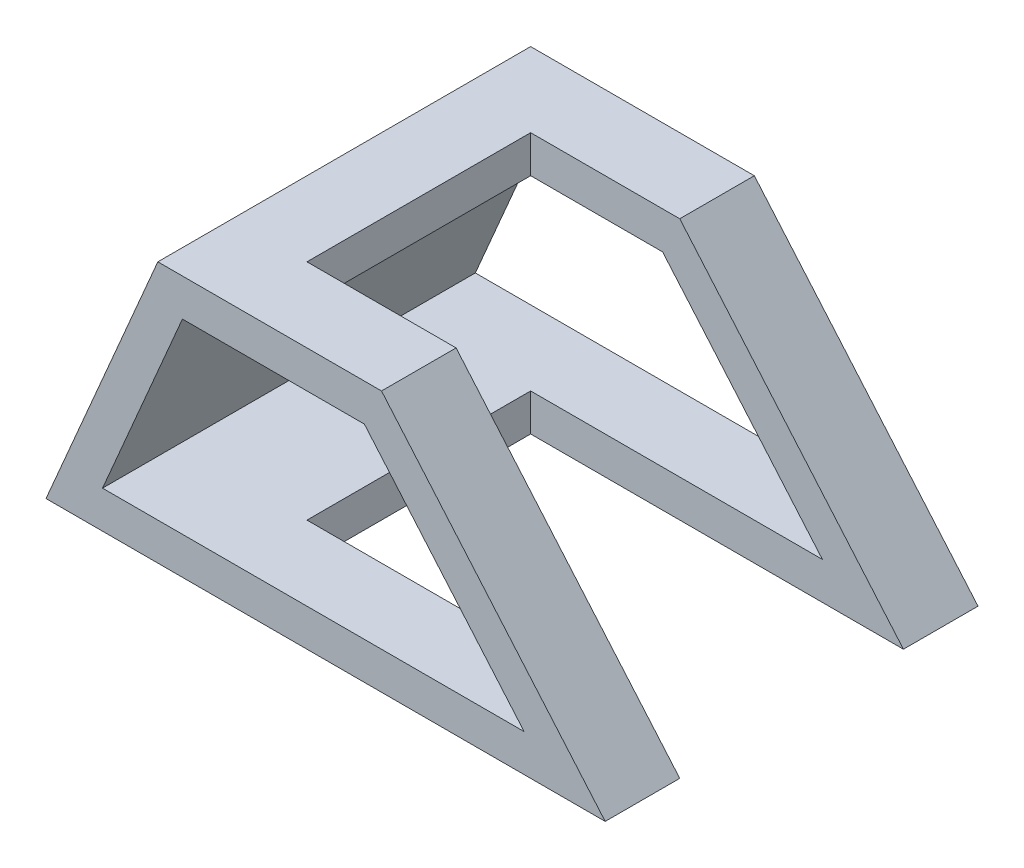
ISO-10303-21;
HEADER;
FILE_DESCRIPTION(('STEP AP214'),'2;1');
FILE_NAME('part.step','',(''),(''),'','','');
FILE_SCHEMA(('AUTOMOTIVE_DESIGN { 1 0 10303 214 1 1 1 1 }'));
ENDSEC;
DATA;
#1=APPLICATION_CONTEXT('core data for automotive mechanical design processes');
#2=APPLICATION_PROTOCOL_DEFINITION('international standard','automotive_design',2000,#1);
#3=PRODUCT_CONTEXT('',#1,'mechanical');
#4=PRODUCT('Part','Part','',(#3));
#5=PRODUCT_RELATED_PRODUCT_CATEGORY('part','',(#4));
#6=PRODUCT_DEFINITION_FORMATION('','',#4);
#7=PRODUCT_DEFINITION_CONTEXT('part definition',#1,'design');
#8=PRODUCT_DEFINITION('design','',#6,#7);
#9=PRODUCT_DEFINITION_SHAPE('','',#8);
#10=(LENGTH_UNIT() NAMED_UNIT(*) SI_UNIT(.MILLI.,.METRE.));
#11=(NAMED_UNIT(*) PLANE_ANGLE_UNIT() SI_UNIT($,.RADIAN.));
#12=(NAMED_UNIT(*) SI_UNIT($,.STERADIAN.) SOLID_ANGLE_UNIT());
#13=UNCERTAINTY_MEASURE_WITH_UNIT(LENGTH_MEASURE(1.E-05),#10,'distance_accuracy_value','');
#14=(GEOMETRIC_REPRESENTATION_CONTEXT(3) GLOBAL_UNCERTAINTY_ASSIGNED_CONTEXT((#13)) GLOBAL_UNIT_ASSIGNED_CONTEXT((#10,
#11,#12)) REPRESENTATION_CONTEXT('',''));
#15=CARTESIAN_POINT('',(0.,0.,0.));
#16=DIRECTION('',(0.,0.,1.));
#17=DIRECTION('',(1.,0.,0.));
#18=AXIS2_PLACEMENT_3D('',#15,#16,#17);
#19=CARTESIAN_POINT('',(150.,0.,100.));
#20=DIRECTION('',(-0.759256602365297,-0.650791373455968,0.));
#21=DIRECTION('',(0.650791373455968,-0.759256602365297,0.));
#22=AXIS2_PLACEMENT_3D('',#19,#20,#21);
#23=PLANE('',#22);
#24=DIRECTION('',(0.,0.,-1.));
#25=VECTOR('',#24,1.);
#26=CARTESIAN_POINT('',(150.,0.,100.));
#27=LINE('',#26,#25);
#28=CARTESIAN_POINT('',(150.,0.,100.));
#29=VERTEX_POINT('',#28);
#30=CARTESIAN_POINT('',(150.,0.,80.));
#31=VERTEX_POINT('',#30);
#32=EDGE_CURVE('E174',#29,#31,#27,.T.);
#33=ORIENTED_EDGE('',*,*,#32,.T.);
#34=DIRECTION('',(-0.650791373455968,0.759256602365297,0.));
#35=VECTOR('',#34,1.);
#36=CARTESIAN_POINT('',(150.,0.,80.));
#37=LINE('',#36,#35);
#38=CARTESIAN_POINT('',(90.,70.,80.));
#39=VERTEX_POINT('',#38);
#40=EDGE_CURVE('E204',#31,#39,#37,.T.);
#41=ORIENTED_EDGE('',*,*,#40,.T.);
#42=DIRECTION('',(0.,0.,-1.));
#43=VECTOR('',#42,1.);
#44=CARTESIAN_POINT('',(90.,70.,100.));
#45=LINE('',#44,#43);
#46=CARTESIAN_POINT('',(90.,70.,100.));
#47=VERTEX_POINT('',#46);
#48=EDGE_CURVE('E175',#47,#39,#45,.T.);
#49=ORIENTED_EDGE('',*,*,#48,.F.);
#50=DIRECTION('',(-0.650791373455968,0.759256602365297,0.));
#51=VECTOR('',#50,1.);
#52=CARTESIAN_POINT('',(150.,0.,100.));
#53=LINE('',#52,#51);
#54=EDGE_CURVE('E230',#29,#47,#53,.T.);
#55=ORIENTED_EDGE('',*,*,#54,.F.);
#56=EDGE_LOOP('',(#33,#41,#49,#55));
#57=FACE_BOUND('',#56,.T.);
#58=ADVANCED_FACE('F39',(#57),#23,.F.);
#59=CARTESIAN_POINT('',(128.257793632439,10.,100.));
#60=DIRECTION('',(-0.759256602365297,-0.650791373455968,0.));
#61=DIRECTION('',(0.650791373455968,-0.759256602365297,0.));
#62=AXIS2_PLACEMENT_3D('',#59,#60,#61);
#63=PLANE('',#62);
#64=DIRECTION('',(-0.650791373455968,0.759256602365297,0.));
#65=VECTOR('',#64,1.);
#66=CARTESIAN_POINT('',(128.257793632439,10.,80.));
#67=LINE('',#66,#65);
#68=CARTESIAN_POINT('',(128.257793632439,10.,80.));
#69=VERTEX_POINT('',#68);
#70=CARTESIAN_POINT('',(85.4006507752959,60.,80.));
#71=VERTEX_POINT('',#70);
#72=EDGE_CURVE('E47',#69,#71,#67,.T.);
#73=ORIENTED_EDGE('',*,*,#72,.F.);
#74=DIRECTION('',(0.,0.,-1.));
#75=VECTOR('',#74,1.);
#76=CARTESIAN_POINT('',(128.257793632439,10.,100.));
#77=LINE('',#76,#75);
#78=CARTESIAN_POINT('',(128.257793632439,10.,100.));
#79=VERTEX_POINT('',#78);
#80=EDGE_CURVE('E212',#79,#69,#77,.T.);
#81=ORIENTED_EDGE('',*,*,#80,.F.);
#82=DIRECTION('',(-0.650791373455968,0.759256602365297,0.));
#83=VECTOR('',#82,1.);
#84=CARTESIAN_POINT('',(128.257793632439,10.,100.));
#85=LINE('',#84,#83);
#86=CARTESIAN_POINT('',(85.4006507752959,60.,100.));
#87=VERTEX_POINT('',#86);
#88=EDGE_CURVE('E208',#79,#87,#85,.T.);
#89=ORIENTED_EDGE('',*,*,#88,.T.);
#90=DIRECTION('',(0.,0.,-1.));
#91=VECTOR('',#90,1.);
#92=CARTESIAN_POINT('',(85.4006507752959,60.,100.));
#93=LINE('',#92,#91);
#94=EDGE_CURVE('E201',#87,#71,#93,.T.);
#95=ORIENTED_EDGE('',*,*,#94,.T.);
#96=EDGE_LOOP('',(#73,#81,#89,#95));
#97=FACE_BOUND('',#96,.T.);
#98=ADVANCED_FACE('F206',(#97),#63,.T.);
#99=CARTESIAN_POINT('',(0.,0.,100.));
#100=DIRECTION('',(0.,0.,1.));
#101=DIRECTION('',(1.,0.,0.));
#102=AXIS2_PLACEMENT_3D('',#99,#100,#101);
#103=PLANE('',#102);
#104=DIRECTION('',(-0.393919298579168,-0.919145030018058,0.));
#105=VECTOR('',#104,1.);
#106=CARTESIAN_POINT('',(30.,70.,100.));
#107=LINE('',#106,#105);
#108=CARTESIAN_POINT('',(30.,70.,100.));
#109=VERTEX_POINT('',#108);
#110=CARTESIAN_POINT('',(0.,0.,100.));
#111=VERTEX_POINT('',#110);
#112=EDGE_CURVE('E224',#109,#111,#107,.T.);
#113=ORIENTED_EDGE('',*,*,#112,.T.);
#114=DIRECTION('',(1.,0.,0.));
#115=VECTOR('',#114,1.);
#116=CARTESIAN_POINT('',(0.,0.,100.));
#117=LINE('',#116,#115);
#118=EDGE_CURVE('E227',#111,#29,#117,.T.);
#119=ORIENTED_EDGE('',*,*,#118,.T.);
#120=ORIENTED_EDGE('',*,*,#54,.T.);
#121=DIRECTION('',(-1.,0.,0.));
#122=VECTOR('',#121,1.);
#123=CARTESIAN_POINT('',(90.,70.,100.));
#124=LINE('',#123,#122);
#125=EDGE_CURVE('E232',#47,#109,#124,.T.);
#126=ORIENTED_EDGE('',*,*,#125,.T.);
#127=EDGE_LOOP('',(#113,#119,#120,#126));
#128=FACE_BOUND('',#127,.T.);
#129=DIRECTION('',(-0.393919298579167,-0.919145030018058,0.));
#130=VECTOR('',#129,1.);
#131=CARTESIAN_POINT('',(36.5939615798056,60.,100.));
#132=LINE('',#131,#130);
#133=CARTESIAN_POINT('',(36.5939615798056,60.,100.));
#134=VERTEX_POINT('',#133);
#135=CARTESIAN_POINT('',(15.1653901512342,10.,100.));
#136=VERTEX_POINT('',#135);
#137=EDGE_CURVE('E272',#134,#136,#132,.T.);
#138=ORIENTED_EDGE('',*,*,#137,.F.);
#139=DIRECTION('',(-1.,0.,0.));
#140=VECTOR('',#139,1.);
#141=CARTESIAN_POINT('',(85.4006507752959,60.,100.));
#142=LINE('',#141,#140);
#143=EDGE_CURVE('E270',#87,#134,#142,.T.);
#144=ORIENTED_EDGE('',*,*,#143,.F.);
#145=ORIENTED_EDGE('',*,*,#88,.F.);
#146=DIRECTION('',(1.,0.,0.));
#147=VECTOR('',#146,1.);
#148=CARTESIAN_POINT('',(15.1653901512342,10.,100.));
#149=LINE('',#148,#147);
#150=EDGE_CURVE('E274',#136,#79,#149,.T.);
#151=ORIENTED_EDGE('',*,*,#150,.F.);
#152=EDGE_LOOP('',(#138,#144,#145,#151));
#153=FACE_BOUND('',#152,.T.);
#154=ADVANCED_FACE('F258',(#128,#153),#103,.T.);
#155=CARTESIAN_POINT('',(0.,0.,0.));
#156=DIRECTION('',(0.,0.,1.));
#157=DIRECTION('',(1.,0.,0.));
#158=AXIS2_PLACEMENT_3D('',#155,#156,#157);
#159=PLANE('',#158);
#160=DIRECTION('',(-0.393919298579168,-0.919145030018058,0.));
#161=VECTOR('',#160,1.);
#162=CARTESIAN_POINT('',(30.,70.,0.));
#163=LINE('',#162,#161);
#164=CARTESIAN_POINT('',(30.,70.,0.));
#165=VERTEX_POINT('',#164);
#166=CARTESIAN_POINT('',(0.,0.,0.));
#167=VERTEX_POINT('',#166);
#168=EDGE_CURVE('E223',#165,#167,#163,.T.);
#169=ORIENTED_EDGE('',*,*,#168,.F.);
#170=DIRECTION('',(-1.,0.,0.));
#171=VECTOR('',#170,1.);
#172=CARTESIAN_POINT('',(90.,70.,0.));
#173=LINE('',#172,#171);
#174=CARTESIAN_POINT('',(90.,70.,0.));
#175=VERTEX_POINT('',#174);
#176=EDGE_CURVE('E228',#175,#165,#173,.T.);
#177=ORIENTED_EDGE('',*,*,#176,.F.);
#178=DIRECTION('',(-0.650791373455968,0.759256602365297,0.));
#179=VECTOR('',#178,1.);
#180=CARTESIAN_POINT('',(150.,0.,0.));
#181=LINE('',#180,#179);
#182=CARTESIAN_POINT('',(150.,0.,0.));
#183=VERTEX_POINT('',#182);
#184=EDGE_CURVE('E238',#183,#175,#181,.T.);
#185=ORIENTED_EDGE('',*,*,#184,.F.);
#186=DIRECTION('',(1.,0.,0.));
#187=VECTOR('',#186,1.);
#188=CARTESIAN_POINT('',(0.,0.,0.));
#189=LINE('',#188,#187);
#190=EDGE_CURVE('E172',#167,#183,#189,.T.);
#191=ORIENTED_EDGE('',*,*,#190,.F.);
#192=EDGE_LOOP('',(#169,#177,#185,#191));
#193=FACE_BOUND('',#192,.T.);
#194=DIRECTION('',(-1.,0.,0.));
#195=VECTOR('',#194,1.);
#196=CARTESIAN_POINT('',(85.4006507752959,60.,0.));
#197=LINE('',#196,#195);
#198=CARTESIAN_POINT('',(85.4006507752959,60.,0.));
#199=VERTEX_POINT('',#198);
#200=CARTESIAN_POINT('',(36.5939615798056,60.,0.));
#201=VERTEX_POINT('',#200);
#202=EDGE_CURVE('E266',#199,#201,#197,.T.);
#203=ORIENTED_EDGE('',*,*,#202,.T.);
#204=DIRECTION('',(-0.393919298579167,-0.919145030018058,0.));
#205=VECTOR('',#204,1.);
#206=CARTESIAN_POINT('',(36.5939615798056,60.,0.));
#207=LINE('',#206,#205);
#208=CARTESIAN_POINT('',(15.1653901512342,10.,0.));
#209=VERTEX_POINT('',#208);
#210=EDGE_CURVE('E280',#201,#209,#207,.T.);
#211=ORIENTED_EDGE('',*,*,#210,.T.);
#212=DIRECTION('',(1.,0.,0.));
#213=VECTOR('',#212,1.);
#214=CARTESIAN_POINT('',(15.1653901512342,10.,0.));
#215=LINE('',#214,#213);
#216=CARTESIAN_POINT('',(128.257793632439,10.,0.));
#217=VERTEX_POINT('',#216);
#218=EDGE_CURVE('E282',#209,#217,#215,.T.);
#219=ORIENTED_EDGE('',*,*,#218,.T.);
#220=DIRECTION('',(-0.650791373455968,0.759256602365297,0.));
#221=VECTOR('',#220,1.);
#222=CARTESIAN_POINT('',(128.257793632439,10.,0.));
#223=LINE('',#222,#221);
#224=EDGE_CURVE('E215',#217,#199,#223,.T.);
#225=ORIENTED_EDGE('',*,*,#224,.T.);
#226=EDGE_LOOP('',(#203,#211,#219,#225));
#227=FACE_BOUND('',#226,.T.);
#228=ADVANCED_FACE('F251',(#193,#227),#159,.F.);
#229=CARTESIAN_POINT('',(30.,70.,100.));
#230=DIRECTION('',(0.919145030018058,-0.393919298579168,0.));
#231=DIRECTION('',(0.393919298579168,0.919145030018058,0.));
#232=AXIS2_PLACEMENT_3D('',#229,#230,#231);
#233=PLANE('',#232);
#234=ORIENTED_EDGE('',*,*,#168,.T.);
#235=DIRECTION('',(0.,0.,-1.));
#236=VECTOR('',#235,1.);
#237=CARTESIAN_POINT('',(0.,0.,100.));
#238=LINE('',#237,#236);
#239=EDGE_CURVE('E178',#111,#167,#238,.T.);
#240=ORIENTED_EDGE('',*,*,#239,.F.);
#241=ORIENTED_EDGE('',*,*,#112,.F.);
#242=DIRECTION('',(0.,0.,-1.));
#243=VECTOR('',#242,1.);
#244=CARTESIAN_POINT('',(30.,70.,100.));
#245=LINE('',#244,#243);
#246=EDGE_CURVE('E234',#109,#165,#245,.T.);
#247=ORIENTED_EDGE('',*,*,#246,.T.);
#248=EDGE_LOOP('',(#234,#240,#241,#247));
#249=FACE_BOUND('',#248,.T.);
#250=ADVANCED_FACE('F41',(#249),#233,.F.);
#251=CARTESIAN_POINT('',(0.,0.,100.));
#252=DIRECTION('',(0.,1.,0.));
#253=DIRECTION('',(0.,0.,1.));
#254=AXIS2_PLACEMENT_3D('',#251,#252,#253);
#255=PLANE('',#254);
#256=DIRECTION('',(0.,0.,1.));
#257=VECTOR('',#256,1.);
#258=CARTESIAN_POINT('',(50.,0.,20.));
#259=LINE('',#258,#257);
#260=CARTESIAN_POINT('',(50.,0.,20.));
#261=VERTEX_POINT('',#260);
#262=CARTESIAN_POINT('',(50.,0.,80.));
#263=VERTEX_POINT('',#262);
#264=EDGE_CURVE('E158',#261,#263,#259,.T.);
#265=ORIENTED_EDGE('',*,*,#264,.T.);
#266=DIRECTION('',(1.,0.,0.));
#267=VECTOR('',#266,1.);
#268=CARTESIAN_POINT('',(150.,0.,80.));
#269=LINE('',#268,#267);
#270=EDGE_CURVE('E316',#263,#31,#269,.T.);
#271=ORIENTED_EDGE('',*,*,#270,.T.);
#272=ORIENTED_EDGE('',*,*,#32,.F.);
#273=ORIENTED_EDGE('',*,*,#118,.F.);
#274=ORIENTED_EDGE('',*,*,#239,.T.);
#275=ORIENTED_EDGE('',*,*,#190,.T.);
#276=CARTESIAN_POINT('',(150.,0.,20.));
#277=VERTEX_POINT('',#276);
#278=EDGE_CURVE('E165',#277,#183,#27,.T.);
#279=ORIENTED_EDGE('',*,*,#278,.F.);
#280=DIRECTION('',(-1.,0.,0.));
#281=VECTOR('',#280,1.);
#282=CARTESIAN_POINT('',(150.,0.,20.));
#283=LINE('',#282,#281);
#284=EDGE_CURVE('E150',#277,#261,#283,.T.);
#285=ORIENTED_EDGE('',*,*,#284,.T.);
#286=EDGE_LOOP('',(#265,#271,#272,#273,#274,#275,#279,#285));
#287=FACE_BOUND('',#286,.T.);
#288=ADVANCED_FACE('F170',(#287),#255,.F.);
#289=CARTESIAN_POINT('',(90.,70.,20.));
#290=VERTEX_POINT('',#289);
#291=EDGE_CURVE('E167',#290,#175,#45,.T.);
#292=ORIENTED_EDGE('',*,*,#291,.F.);
#293=DIRECTION('',(0.650791373455968,-0.759256602365297,0.));
#294=VECTOR('',#293,1.);
#295=CARTESIAN_POINT('',(150.,0.,20.));
#296=LINE('',#295,#294);
#297=EDGE_CURVE('E54',#290,#277,#296,.T.);
#298=ORIENTED_EDGE('',*,*,#297,.T.);
#299=ORIENTED_EDGE('',*,*,#278,.T.);
#300=ORIENTED_EDGE('',*,*,#184,.T.);
#301=EDGE_LOOP('',(#292,#298,#299,#300));
#302=FACE_BOUND('',#301,.T.);
#303=ADVANCED_FACE('F163',(#302),#23,.F.);
#304=CARTESIAN_POINT('',(90.,70.,100.));
#305=DIRECTION('',(0.,-1.,0.));
#306=DIRECTION('',(1.,0.,0.));
#307=AXIS2_PLACEMENT_3D('',#304,#305,#306);
#308=PLANE('',#307);
#309=ORIENTED_EDGE('',*,*,#48,.T.);
#310=DIRECTION('',(1.,0.,0.));
#311=VECTOR('',#310,1.);
#312=CARTESIAN_POINT('',(150.,70.,80.));
#313=LINE('',#312,#311);
#314=CARTESIAN_POINT('',(50.,70.,80.));
#315=VERTEX_POINT('',#314);
#316=EDGE_CURVE('E159',#315,#39,#313,.T.);
#317=ORIENTED_EDGE('',*,*,#316,.F.);
#318=DIRECTION('',(0.,0.,1.));
#319=VECTOR('',#318,1.);
#320=CARTESIAN_POINT('',(50.,70.,20.));
#321=LINE('',#320,#319);
#322=CARTESIAN_POINT('',(50.,70.,20.));
#323=VERTEX_POINT('',#322);
#324=EDGE_CURVE('E312',#323,#315,#321,.T.);
#325=ORIENTED_EDGE('',*,*,#324,.F.);
#326=DIRECTION('',(-1.,0.,0.));
#327=VECTOR('',#326,1.);
#328=CARTESIAN_POINT('',(150.,70.,20.));
#329=LINE('',#328,#327);
#330=EDGE_CURVE('E249',#290,#323,#329,.T.);
#331=ORIENTED_EDGE('',*,*,#330,.F.);
#332=ORIENTED_EDGE('',*,*,#291,.T.);
#333=ORIENTED_EDGE('',*,*,#176,.T.);
#334=ORIENTED_EDGE('',*,*,#246,.F.);
#335=ORIENTED_EDGE('',*,*,#125,.F.);
#336=EDGE_LOOP('',(#309,#317,#325,#331,#332,#333,#334,#335));
#337=FACE_BOUND('',#336,.T.);
#338=ADVANCED_FACE('F246',(#337),#308,.F.);
#339=CARTESIAN_POINT('',(85.4006507752959,60.,100.));
#340=DIRECTION('',(0.,-1.,0.));
#341=DIRECTION('',(0.,0.,-1.));
#342=AXIS2_PLACEMENT_3D('',#339,#340,#341);
#343=PLANE('',#342);
#344=DIRECTION('',(-1.,0.,0.));
#345=VECTOR('',#344,1.);
#346=CARTESIAN_POINT('',(85.4006507752959,60.,80.));
#347=LINE('',#346,#345);
#348=CARTESIAN_POINT('',(50.,60.,80.));
#349=VERTEX_POINT('',#348);
#350=EDGE_CURVE('E190',#71,#349,#347,.T.);
#351=ORIENTED_EDGE('',*,*,#350,.F.);
#352=ORIENTED_EDGE('',*,*,#94,.F.);
#353=ORIENTED_EDGE('',*,*,#143,.T.);
#354=DIRECTION('',(0.,0.,-1.));
#355=VECTOR('',#354,1.);
#356=CARTESIAN_POINT('',(36.5939615798056,60.,100.));
#357=LINE('',#356,#355);
#358=EDGE_CURVE('E220',#134,#201,#357,.T.);
#359=ORIENTED_EDGE('',*,*,#358,.T.);
#360=ORIENTED_EDGE('',*,*,#202,.F.);
#361=CARTESIAN_POINT('',(85.4006507752959,60.,20.));
#362=VERTEX_POINT('',#361);
#363=EDGE_CURVE('E210',#362,#199,#93,.T.);
#364=ORIENTED_EDGE('',*,*,#363,.F.);
#365=DIRECTION('',(1.,0.,0.));
#366=VECTOR('',#365,1.);
#367=CARTESIAN_POINT('',(85.4006507752959,60.,20.));
#368=LINE('',#367,#366);
#369=CARTESIAN_POINT('',(50.,60.,20.));
#370=VERTEX_POINT('',#369);
#371=EDGE_CURVE('E61',#370,#362,#368,.T.);
#372=ORIENTED_EDGE('',*,*,#371,.F.);
#373=DIRECTION('',(0.,0.,-1.));
#374=VECTOR('',#373,1.);
#375=CARTESIAN_POINT('',(50.,60.,100.));
#376=LINE('',#375,#374);
#377=EDGE_CURVE('E203',#349,#370,#376,.T.);
#378=ORIENTED_EDGE('',*,*,#377,.F.);
#379=EDGE_LOOP('',(#351,#352,#353,#359,#360,#364,#372,#378));
#380=FACE_BOUND('',#379,.T.);
#381=ADVANCED_FACE('F200',(#380),#343,.T.);
#382=CARTESIAN_POINT('',(36.5939615798056,60.,100.));
#383=DIRECTION('',(0.919145030018058,-0.393919298579168,0.));
#384=DIRECTION('',(0.393919298579168,0.919145030018058,0.));
#385=AXIS2_PLACEMENT_3D('',#382,#383,#384);
#386=PLANE('',#385);
#387=ORIENTED_EDGE('',*,*,#210,.F.);
#388=ORIENTED_EDGE('',*,*,#358,.F.);
#389=ORIENTED_EDGE('',*,*,#137,.T.);
#390=DIRECTION('',(0.,0.,-1.));
#391=VECTOR('',#390,1.);
#392=CARTESIAN_POINT('',(15.1653901512342,10.,100.));
#393=LINE('',#392,#391);
#394=EDGE_CURVE('E218',#136,#209,#393,.T.);
#395=ORIENTED_EDGE('',*,*,#394,.T.);
#396=EDGE_LOOP('',(#387,#388,#389,#395));
#397=FACE_BOUND('',#396,.T.);
#398=ADVANCED_FACE('F295',(#397),#386,.T.);
#399=CARTESIAN_POINT('',(15.1653901512342,10.,100.));
#400=DIRECTION('',(0.,1.,0.));
#401=DIRECTION('',(-1.,0.,0.));
#402=AXIS2_PLACEMENT_3D('',#399,#400,#401);
#403=PLANE('',#402);
#404=DIRECTION('',(1.,0.,0.));
#405=VECTOR('',#404,1.);
#406=CARTESIAN_POINT('',(15.1653901512342,10.,80.));
#407=LINE('',#406,#405);
#408=CARTESIAN_POINT('',(50.,10.,80.));
#409=VERTEX_POINT('',#408);
#410=EDGE_CURVE('E168',#409,#69,#407,.T.);
#411=ORIENTED_EDGE('',*,*,#410,.F.);
#412=DIRECTION('',(0.,0.,1.));
#413=VECTOR('',#412,1.);
#414=CARTESIAN_POINT('',(50.,10.,100.));
#415=LINE('',#414,#413);
#416=CARTESIAN_POINT('',(50.,10.,20.));
#417=VERTEX_POINT('',#416);
#418=EDGE_CURVE('E11',#417,#409,#415,.T.);
#419=ORIENTED_EDGE('',*,*,#418,.F.);
#420=DIRECTION('',(-1.,0.,0.));
#421=VECTOR('',#420,1.);
#422=CARTESIAN_POINT('',(15.1653901512341,10.,20.));
#423=LINE('',#422,#421);
#424=CARTESIAN_POINT('',(128.257793632439,10.,20.));
#425=VERTEX_POINT('',#424);
#426=EDGE_CURVE('E302',#425,#417,#423,.T.);
#427=ORIENTED_EDGE('',*,*,#426,.F.);
#428=EDGE_CURVE('E209',#425,#217,#77,.T.);
#429=ORIENTED_EDGE('',*,*,#428,.T.);
#430=ORIENTED_EDGE('',*,*,#218,.F.);
#431=ORIENTED_EDGE('',*,*,#394,.F.);
#432=ORIENTED_EDGE('',*,*,#150,.T.);
#433=ORIENTED_EDGE('',*,*,#80,.T.);
#434=EDGE_LOOP('',(#411,#419,#427,#429,#430,#431,#432,#433));
#435=FACE_BOUND('',#434,.T.);
#436=ADVANCED_FACE('F299',(#435),#403,.T.);
#437=DIRECTION('',(0.650791373455968,-0.759256602365297,0.));
#438=VECTOR('',#437,1.);
#439=CARTESIAN_POINT('',(128.257793632439,10.,20.));
#440=LINE('',#439,#438);
#441=EDGE_CURVE('E184',#362,#425,#440,.T.);
#442=ORIENTED_EDGE('',*,*,#441,.F.);
#443=ORIENTED_EDGE('',*,*,#363,.T.);
#444=ORIENTED_EDGE('',*,*,#224,.F.);
#445=ORIENTED_EDGE('',*,*,#428,.F.);
#446=EDGE_LOOP('',(#442,#443,#444,#445));
#447=FACE_BOUND('',#446,.T.);
#448=ADVANCED_FACE('F290',(#447),#63,.T.);
#449=CARTESIAN_POINT('',(50.,0.,20.));
#450=DIRECTION('',(-1.,0.,0.));
#451=DIRECTION('',(0.,-1.,0.));
#452=AXIS2_PLACEMENT_3D('',#449,#450,#451);
#453=PLANE('',#452);
#454=ORIENTED_EDGE('',*,*,#377,.T.);
#455=DIRECTION('',(0.,1.,0.));
#456=VECTOR('',#455,1.);
#457=CARTESIAN_POINT('',(50.,0.,20.));
#458=LINE('',#457,#456);
#459=EDGE_CURVE('E309',#370,#323,#458,.T.);
#460=ORIENTED_EDGE('',*,*,#459,.T.);
#461=ORIENTED_EDGE('',*,*,#324,.T.);
#462=DIRECTION('',(0.,1.,0.));
#463=VECTOR('',#462,1.);
#464=CARTESIAN_POINT('',(50.,0.,80.));
#465=LINE('',#464,#463);
#466=EDGE_CURVE('E306',#349,#315,#465,.T.);
#467=ORIENTED_EDGE('',*,*,#466,.F.);
#468=EDGE_LOOP('',(#454,#460,#461,#467));
#469=FACE_BOUND('',#468,.T.);
#470=ADVANCED_FACE('F322',(#469),#453,.F.);
#471=CARTESIAN_POINT('',(150.,0.,80.));
#472=DIRECTION('',(0.,0.,1.));
#473=DIRECTION('',(1.,0.,0.));
#474=AXIS2_PLACEMENT_3D('',#471,#472,#473);
#475=PLANE('',#474);
#476=ORIENTED_EDGE('',*,*,#270,.F.);
#477=EDGE_CURVE('E303',#263,#409,#465,.T.);
#478=ORIENTED_EDGE('',*,*,#477,.T.);
#479=ORIENTED_EDGE('',*,*,#410,.T.);
#480=ORIENTED_EDGE('',*,*,#72,.T.);
#481=ORIENTED_EDGE('',*,*,#350,.T.);
#482=ORIENTED_EDGE('',*,*,#466,.T.);
#483=ORIENTED_EDGE('',*,*,#316,.T.);
#484=ORIENTED_EDGE('',*,*,#40,.F.);
#485=EDGE_LOOP('',(#476,#478,#479,#480,#481,#482,#483,#484));
#486=FACE_BOUND('',#485,.T.);
#487=ADVANCED_FACE('F189',(#486),#475,.F.);
#488=CARTESIAN_POINT('',(150.,0.,20.));
#489=DIRECTION('',(0.,0.,-1.));
#490=DIRECTION('',(-1.,0.,0.));
#491=AXIS2_PLACEMENT_3D('',#488,#489,#490);
#492=PLANE('',#491);
#493=ORIENTED_EDGE('',*,*,#330,.T.);
#494=ORIENTED_EDGE('',*,*,#459,.F.);
#495=ORIENTED_EDGE('',*,*,#371,.T.);
#496=ORIENTED_EDGE('',*,*,#441,.T.);
#497=ORIENTED_EDGE('',*,*,#426,.T.);
#498=EDGE_CURVE('E153',#261,#417,#458,.T.);
#499=ORIENTED_EDGE('',*,*,#498,.F.);
#500=ORIENTED_EDGE('',*,*,#284,.F.);
#501=ORIENTED_EDGE('',*,*,#297,.F.);
#502=EDGE_LOOP('',(#493,#494,#495,#496,#497,#499,#500,#501));
#503=FACE_BOUND('',#502,.T.);
#504=ADVANCED_FACE('F151',(#503),#492,.F.);
#505=ORIENTED_EDGE('',*,*,#418,.T.);
#506=ORIENTED_EDGE('',*,*,#477,.F.);
#507=ORIENTED_EDGE('',*,*,#264,.F.);
#508=ORIENTED_EDGE('',*,*,#498,.T.);
#509=EDGE_LOOP('',(#505,#506,#507,#508));
#510=FACE_BOUND('',#509,.T.);
#511=ADVANCED_FACE('F319',(#510),#453,.F.);
#512=CLOSED_SHELL('',(#58,#98,#154,#228,#250,#288,#303,#338,#381,#398,#436,#448,#470,#487,#504,#511));
#513=MANIFOLD_SOLID_BREP('B2',#512);
#514=ADVANCED_BREP_SHAPE_REPRESENTATION('',(#18,#513),#14);
#515=SHAPE_DEFINITION_REPRESENTATION(#9,#514);
ENDSEC;
END-ISO-10303-21;
